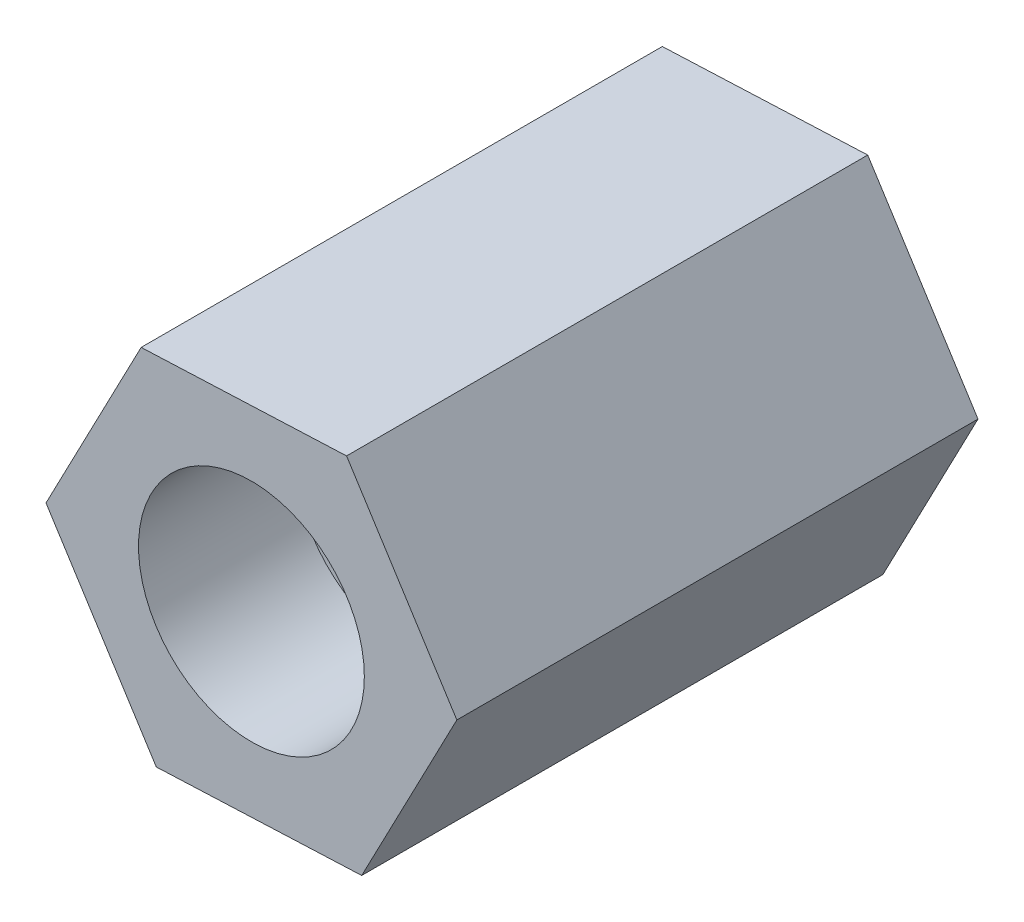
ISO-10303-21;
HEADER;
FILE_DESCRIPTION(('STEP AP214'),'2;1');
FILE_NAME('part.step','',(''),(''),'','','');
FILE_SCHEMA(('AUTOMOTIVE_DESIGN { 1 0 10303 214 1 1 1 1 }'));
ENDSEC;
DATA;
#1=APPLICATION_CONTEXT('core data for automotive mechanical design processes');
#2=APPLICATION_PROTOCOL_DEFINITION('international standard','automotive_design',2000,#1);
#3=PRODUCT_CONTEXT('',#1,'mechanical');
#4=PRODUCT('Part','Part','',(#3));
#5=PRODUCT_RELATED_PRODUCT_CATEGORY('part','',(#4));
#6=PRODUCT_DEFINITION_FORMATION('','',#4);
#7=PRODUCT_DEFINITION_CONTEXT('part definition',#1,'design');
#8=PRODUCT_DEFINITION('design','',#6,#7);
#9=PRODUCT_DEFINITION_SHAPE('','',#8);
#10=(LENGTH_UNIT() NAMED_UNIT(*) SI_UNIT(.MILLI.,.METRE.));
#11=(NAMED_UNIT(*) PLANE_ANGLE_UNIT() SI_UNIT($,.RADIAN.));
#12=(NAMED_UNIT(*) SI_UNIT($,.STERADIAN.) SOLID_ANGLE_UNIT());
#13=UNCERTAINTY_MEASURE_WITH_UNIT(LENGTH_MEASURE(1.E-05),#10,'distance_accuracy_value','');
#14=(GEOMETRIC_REPRESENTATION_CONTEXT(3) GLOBAL_UNCERTAINTY_ASSIGNED_CONTEXT((#13)) GLOBAL_UNIT_ASSIGNED_CONTEXT((#10,
#11,#12)) REPRESENTATION_CONTEXT('',''));
#15=CARTESIAN_POINT('',(0.,0.,0.));
#16=DIRECTION('',(0.,0.,1.));
#17=DIRECTION('',(1.,0.,0.));
#18=AXIS2_PLACEMENT_3D('',#15,#16,#17);
#19=CARTESIAN_POINT('',(10.9542962616372,20.9842018372301,60.));
#20=DIRECTION('',(0.0424733530908673,-0.999097599975707,0.));
#21=DIRECTION('',(0.999097599975707,0.0424733530908673,0.));
#22=AXIS2_PLACEMENT_3D('',#19,#20,#21);
#23=PLANE('',#22);
#24=DIRECTION('',(-0.999097599975707,-0.0424733530908673,0.));
#25=VECTOR('',#24,1.);
#26=CARTESIAN_POINT('',(10.9542962616372,20.9842018372301,0.));
#27=LINE('',#26,#25);
#28=CARTESIAN_POINT('',(10.9542962616372,20.9842018372301,0.));
#29=VERTEX_POINT('',#28);
#30=CARTESIAN_POINT('',(-12.6957037383628,19.9787997617738,0.));
#31=VERTEX_POINT('',#30);
#32=EDGE_CURVE('E121',#29,#31,#27,.T.);
#33=ORIENTED_EDGE('',*,*,#32,.T.);
#34=DIRECTION('',(0.,0.,-1.));
#35=VECTOR('',#34,1.);
#36=CARTESIAN_POINT('',(-12.6957037383628,19.9787997617738,60.));
#37=LINE('',#36,#35);
#38=CARTESIAN_POINT('',(-12.6957037383628,19.9787997617738,60.));
#39=VERTEX_POINT('',#38);
#40=EDGE_CURVE('E11',#39,#31,#37,.T.);
#41=ORIENTED_EDGE('',*,*,#40,.F.);
#42=DIRECTION('',(-0.999097599975707,-0.0424733530908673,0.));
#43=VECTOR('',#42,1.);
#44=CARTESIAN_POINT('',(10.9542962616372,20.9842018372301,60.));
#45=LINE('',#44,#43);
#46=CARTESIAN_POINT('',(10.9542962616372,20.9842018372301,60.));
#47=VERTEX_POINT('',#46);
#48=EDGE_CURVE('E132',#47,#39,#45,.T.);
#49=ORIENTED_EDGE('',*,*,#48,.F.);
#50=DIRECTION('',(0.,0.,-1.));
#51=VECTOR('',#50,1.);
#52=CARTESIAN_POINT('',(10.9542962616372,20.9842018372301,60.));
#53=LINE('',#52,#51);
#54=EDGE_CURVE('E117',#47,#29,#53,.T.);
#55=ORIENTED_EDGE('',*,*,#54,.T.);
#56=EDGE_LOOP('',(#33,#41,#49,#55));
#57=FACE_BOUND('',#56,.T.);
#58=ADVANCED_FACE('F37',(#57),#23,.F.);
#59=CARTESIAN_POINT('',(-12.6957037383628,19.9787997617738,60.));
#60=DIRECTION('',(0.886480578984459,-0.462765797227256,0.));
#61=DIRECTION('',(0.462765797227256,0.886480578984459,0.));
#62=AXIS2_PLACEMENT_3D('',#59,#60,#61);
#63=PLANE('',#62);
#64=DIRECTION('',(-0.462765797227256,-0.886480578984459,0.));
#65=VECTOR('',#64,1.);
#66=CARTESIAN_POINT('',(-12.6957037383628,19.9787997617738,0.));
#67=LINE('',#66,#65);
#68=CARTESIAN_POINT('',(-23.65,-1.00540207545632,0.));
#69=VERTEX_POINT('',#68);
#70=EDGE_CURVE('E124',#31,#69,#67,.T.);
#71=ORIENTED_EDGE('',*,*,#70,.T.);
#72=DIRECTION('',(0.,0.,-1.));
#73=VECTOR('',#72,1.);
#74=CARTESIAN_POINT('',(-23.65,-1.00540207545632,60.));
#75=LINE('',#74,#73);
#76=CARTESIAN_POINT('',(-23.65,-1.00540207545632,60.));
#77=VERTEX_POINT('',#76);
#78=EDGE_CURVE('E45',#77,#69,#75,.T.);
#79=ORIENTED_EDGE('',*,*,#78,.F.);
#80=DIRECTION('',(-0.462765797227256,-0.886480578984459,0.));
#81=VECTOR('',#80,1.);
#82=CARTESIAN_POINT('',(-12.6957037383628,19.9787997617738,60.));
#83=LINE('',#82,#81);
#84=EDGE_CURVE('E90',#39,#77,#83,.T.);
#85=ORIENTED_EDGE('',*,*,#84,.F.);
#86=ORIENTED_EDGE('',*,*,#40,.T.);
#87=EDGE_LOOP('',(#71,#79,#85,#86));
#88=FACE_BOUND('',#87,.T.);
#89=ADVANCED_FACE('F157',(#88),#63,.F.);
#90=CARTESIAN_POINT('',(-23.65,-1.00540207545632,60.));
#91=DIRECTION('',(0.844007225893592,0.536331802748451,0.));
#92=DIRECTION('',(-0.536331802748451,0.844007225893592,0.));
#93=AXIS2_PLACEMENT_3D('',#90,#91,#92);
#94=PLANE('',#93);
#95=DIRECTION('',(0.536331802748451,-0.844007225893592,0.));
#96=VECTOR('',#95,1.);
#97=CARTESIAN_POINT('',(-23.65,-1.00540207545632,0.));
#98=LINE('',#97,#96);
#99=CARTESIAN_POINT('',(-10.9542962616372,-20.9842018372301,0.));
#100=VERTEX_POINT('',#99);
#101=EDGE_CURVE('E127',#69,#100,#98,.T.);
#102=ORIENTED_EDGE('',*,*,#101,.T.);
#103=DIRECTION('',(0.,0.,-1.));
#104=VECTOR('',#103,1.);
#105=CARTESIAN_POINT('',(-10.9542962616372,-20.9842018372301,60.));
#106=LINE('',#105,#104);
#107=CARTESIAN_POINT('',(-10.9542962616372,-20.9842018372301,60.));
#108=VERTEX_POINT('',#107);
#109=EDGE_CURVE('E112',#108,#100,#106,.T.);
#110=ORIENTED_EDGE('',*,*,#109,.F.);
#111=DIRECTION('',(0.536331802748451,-0.844007225893592,0.));
#112=VECTOR('',#111,1.);
#113=CARTESIAN_POINT('',(-23.65,-1.00540207545632,60.));
#114=LINE('',#113,#112);
#115=EDGE_CURVE('E103',#77,#108,#114,.T.);
#116=ORIENTED_EDGE('',*,*,#115,.F.);
#117=ORIENTED_EDGE('',*,*,#78,.T.);
#118=EDGE_LOOP('',(#102,#110,#116,#117));
#119=FACE_BOUND('',#118,.T.);
#120=ADVANCED_FACE('F138',(#119),#94,.F.);
#121=CARTESIAN_POINT('',(-10.9542962616372,-20.9842018372301,60.));
#122=DIRECTION('',(-0.0424733530908675,0.999097599975707,0.));
#123=DIRECTION('',(-0.999097599975707,-0.0424733530908675,0.));
#124=AXIS2_PLACEMENT_3D('',#121,#122,#123);
#125=PLANE('',#124);
#126=DIRECTION('',(0.999097599975707,0.0424733530908675,0.));
#127=VECTOR('',#126,1.);
#128=CARTESIAN_POINT('',(-10.9542962616372,-20.9842018372301,0.));
#129=LINE('',#128,#127);
#130=CARTESIAN_POINT('',(12.6957037383628,-19.9787997617738,0.));
#131=VERTEX_POINT('',#130);
#132=EDGE_CURVE('E111',#100,#131,#129,.T.);
#133=ORIENTED_EDGE('',*,*,#132,.T.);
#134=DIRECTION('',(0.,0.,-1.));
#135=VECTOR('',#134,1.);
#136=CARTESIAN_POINT('',(12.6957037383628,-19.9787997617738,60.));
#137=LINE('',#136,#135);
#138=CARTESIAN_POINT('',(12.6957037383628,-19.9787997617738,60.));
#139=VERTEX_POINT('',#138);
#140=EDGE_CURVE('E108',#139,#131,#137,.T.);
#141=ORIENTED_EDGE('',*,*,#140,.F.);
#142=DIRECTION('',(0.999097599975707,0.0424733530908675,0.));
#143=VECTOR('',#142,1.);
#144=CARTESIAN_POINT('',(-10.9542962616372,-20.9842018372301,60.));
#145=LINE('',#144,#143);
#146=EDGE_CURVE('E97',#108,#139,#145,.T.);
#147=ORIENTED_EDGE('',*,*,#146,.F.);
#148=ORIENTED_EDGE('',*,*,#109,.T.);
#149=EDGE_LOOP('',(#133,#141,#147,#148));
#150=FACE_BOUND('',#149,.T.);
#151=ADVANCED_FACE('F109',(#150),#125,.F.);
#152=CARTESIAN_POINT('',(12.6957037383628,-19.9787997617738,60.));
#153=DIRECTION('',(-0.886480578984459,0.462765797227256,0.));
#154=DIRECTION('',(-0.462765797227256,-0.886480578984459,0.));
#155=AXIS2_PLACEMENT_3D('',#152,#153,#154);
#156=PLANE('',#155);
#157=DIRECTION('',(0.462765797227256,0.886480578984459,0.));
#158=VECTOR('',#157,1.);
#159=CARTESIAN_POINT('',(12.6957037383628,-19.9787997617738,0.));
#160=LINE('',#159,#158);
#161=CARTESIAN_POINT('',(23.65,1.00540207545633,0.));
#162=VERTEX_POINT('',#161);
#163=EDGE_CURVE('E76',#131,#162,#160,.T.);
#164=ORIENTED_EDGE('',*,*,#163,.T.);
#165=DIRECTION('',(0.,0.,-1.));
#166=VECTOR('',#165,1.);
#167=CARTESIAN_POINT('',(23.65,1.00540207545633,60.));
#168=LINE('',#167,#166);
#169=CARTESIAN_POINT('',(23.65,1.00540207545633,60.));
#170=VERTEX_POINT('',#169);
#171=EDGE_CURVE('E113',#170,#162,#168,.T.);
#172=ORIENTED_EDGE('',*,*,#171,.F.);
#173=DIRECTION('',(0.462765797227256,0.886480578984459,0.));
#174=VECTOR('',#173,1.);
#175=CARTESIAN_POINT('',(12.6957037383628,-19.9787997617738,60.));
#176=LINE('',#175,#174);
#177=EDGE_CURVE('E101',#139,#170,#176,.T.);
#178=ORIENTED_EDGE('',*,*,#177,.F.);
#179=ORIENTED_EDGE('',*,*,#140,.T.);
#180=EDGE_LOOP('',(#164,#172,#178,#179));
#181=FACE_BOUND('',#180,.T.);
#182=ADVANCED_FACE('F115',(#181),#156,.F.);
#183=CARTESIAN_POINT('',(23.65,1.00540207545633,60.));
#184=DIRECTION('',(-0.844007225893592,-0.536331802748451,0.));
#185=DIRECTION('',(0.536331802748451,-0.844007225893592,0.));
#186=AXIS2_PLACEMENT_3D('',#183,#184,#185);
#187=PLANE('',#186);
#188=DIRECTION('',(-0.536331802748451,0.844007225893592,0.));
#189=VECTOR('',#188,1.);
#190=CARTESIAN_POINT('',(23.65,1.00540207545633,0.));
#191=LINE('',#190,#189);
#192=EDGE_CURVE('E82',#162,#29,#191,.T.);
#193=ORIENTED_EDGE('',*,*,#192,.T.);
#194=ORIENTED_EDGE('',*,*,#54,.F.);
#195=DIRECTION('',(-0.536331802748451,0.844007225893592,0.));
#196=VECTOR('',#195,1.);
#197=CARTESIAN_POINT('',(23.65,1.00540207545633,60.));
#198=LINE('',#197,#196);
#199=EDGE_CURVE('E53',#170,#47,#198,.T.);
#200=ORIENTED_EDGE('',*,*,#199,.F.);
#201=ORIENTED_EDGE('',*,*,#171,.T.);
#202=EDGE_LOOP('',(#193,#194,#200,#201));
#203=FACE_BOUND('',#202,.T.);
#204=ADVANCED_FACE('F145',(#203),#187,.F.);
#205=CARTESIAN_POINT('',(-12.6957037383628,19.9787997617738,60.));
#206=DIRECTION('',(0.,0.,1.));
#207=DIRECTION('',(1.,0.,0.));
#208=AXIS2_PLACEMENT_3D('',#205,#206,#207);
#209=PLANE('',#208);
#210=CARTESIAN_POINT('',(0.,0.,60.));
#211=DIRECTION('',(0.,0.,1.));
#212=DIRECTION('',(1.,0.,0.));
#213=AXIS2_PLACEMENT_3D('',#210,#211,#212);
#214=CIRCLE('',#213,13.);
#215=CARTESIAN_POINT('',(13.,0.,60.));
#216=VERTEX_POINT('',#215);
#217=EDGE_CURVE('E235',#216,#216,#214,.T.);
#218=ORIENTED_EDGE('',*,*,#217,.F.);
#219=EDGE_LOOP('',(#218));
#220=FACE_BOUND('',#219,.T.);
#221=ORIENTED_EDGE('',*,*,#48,.T.);
#222=ORIENTED_EDGE('',*,*,#84,.T.);
#223=ORIENTED_EDGE('',*,*,#115,.T.);
#224=ORIENTED_EDGE('',*,*,#146,.T.);
#225=ORIENTED_EDGE('',*,*,#177,.T.);
#226=ORIENTED_EDGE('',*,*,#199,.T.);
#227=EDGE_LOOP('',(#221,#222,#223,#224,#225,#226));
#228=FACE_BOUND('',#227,.T.);
#229=ADVANCED_FACE('F99',(#220,#228),#209,.T.);
#230=CARTESIAN_POINT('',(-12.6957037383628,19.9787997617738,0.));
#231=DIRECTION('',(0.,0.,1.));
#232=DIRECTION('',(1.,0.,0.));
#233=AXIS2_PLACEMENT_3D('',#230,#231,#232);
#234=PLANE('',#233);
#235=CARTESIAN_POINT('',(0.,0.,0.));
#236=DIRECTION('',(0.,0.,1.));
#237=DIRECTION('',(1.,0.,0.));
#238=AXIS2_PLACEMENT_3D('',#235,#236,#237);
#239=CIRCLE('',#238,11.1);
#240=CARTESIAN_POINT('',(11.1,0.,0.));
#241=VERTEX_POINT('',#240);
#242=EDGE_CURVE('E230',#241,#241,#239,.T.);
#243=ORIENTED_EDGE('',*,*,#242,.T.);
#244=EDGE_LOOP('',(#243));
#245=FACE_BOUND('',#244,.T.);
#246=ORIENTED_EDGE('',*,*,#32,.F.);
#247=ORIENTED_EDGE('',*,*,#192,.F.);
#248=ORIENTED_EDGE('',*,*,#163,.F.);
#249=ORIENTED_EDGE('',*,*,#132,.F.);
#250=ORIENTED_EDGE('',*,*,#101,.F.);
#251=ORIENTED_EDGE('',*,*,#70,.F.);
#252=EDGE_LOOP('',(#246,#247,#248,#249,#250,#251));
#253=FACE_BOUND('',#252,.T.);
#254=ADVANCED_FACE('F141',(#245,#253),#234,.F.);
#255=CARTESIAN_POINT('',(0.,0.,42.));
#256=DIRECTION('',(0.,0.,1.));
#257=DIRECTION('',(1.,0.,0.));
#258=AXIS2_PLACEMENT_3D('',#255,#256,#257);
#259=CYLINDRICAL_SURFACE('',#258,13.);
#260=CARTESIAN_POINT('',(0.,0.,42.));
#261=DIRECTION('',(0.,0.,1.));
#262=DIRECTION('',(1.,0.,0.));
#263=AXIS2_PLACEMENT_3D('',#260,#261,#262);
#264=CIRCLE('',#263,13.);
#265=CARTESIAN_POINT('',(13.,0.,42.));
#266=VERTEX_POINT('',#265);
#267=EDGE_CURVE('E125',#266,#266,#264,.T.);
#268=ORIENTED_EDGE('',*,*,#267,.F.);
#269=EDGE_LOOP('',(#268));
#270=FACE_BOUND('',#269,.T.);
#271=ORIENTED_EDGE('',*,*,#217,.T.);
#272=EDGE_LOOP('',(#271));
#273=FACE_BOUND('',#272,.T.);
#274=ADVANCED_FACE('F192',(#270,#273),#259,.F.);
#275=CARTESIAN_POINT('',(0.,0.,42.));
#276=DIRECTION('',(0.,0.,1.));
#277=DIRECTION('',(1.,0.,0.));
#278=AXIS2_PLACEMENT_3D('',#275,#276,#277);
#279=PLANE('',#278);
#280=CARTESIAN_POINT('',(0.,0.,42.));
#281=DIRECTION('',(0.,0.,1.));
#282=DIRECTION('',(1.,0.,0.));
#283=AXIS2_PLACEMENT_3D('',#280,#281,#282);
#284=CIRCLE('',#283,11.1);
#285=CARTESIAN_POINT('',(11.1,0.,42.));
#286=VERTEX_POINT('',#285);
#287=EDGE_CURVE('E233',#286,#286,#284,.T.);
#288=ORIENTED_EDGE('',*,*,#287,.F.);
#289=EDGE_LOOP('',(#288));
#290=FACE_BOUND('',#289,.T.);
#291=ORIENTED_EDGE('',*,*,#267,.T.);
#292=EDGE_LOOP('',(#291));
#293=FACE_BOUND('',#292,.T.);
#294=ADVANCED_FACE('F197',(#290,#293),#279,.T.);
#295=CARTESIAN_POINT('',(0.,0.,0.));
#296=DIRECTION('',(0.,0.,1.));
#297=DIRECTION('',(1.,0.,0.));
#298=AXIS2_PLACEMENT_3D('',#295,#296,#297);
#299=CYLINDRICAL_SURFACE('',#298,11.1);
#300=ORIENTED_EDGE('',*,*,#242,.F.);
#301=EDGE_LOOP('',(#300));
#302=FACE_BOUND('',#301,.T.);
#303=ORIENTED_EDGE('',*,*,#287,.T.);
#304=EDGE_LOOP('',(#303));
#305=FACE_BOUND('',#304,.T.);
#306=ADVANCED_FACE('F213',(#302,#305),#299,.F.);
#307=CLOSED_SHELL('',(#58,#89,#120,#151,#182,#204,#229,#254,#274,#294,#306));
#308=MANIFOLD_SOLID_BREP('B2',#307);
#309=ADVANCED_BREP_SHAPE_REPRESENTATION('',(#18,#308),#14);
#310=SHAPE_DEFINITION_REPRESENTATION(#9,#309);
ENDSEC;
END-ISO-10303-21;
